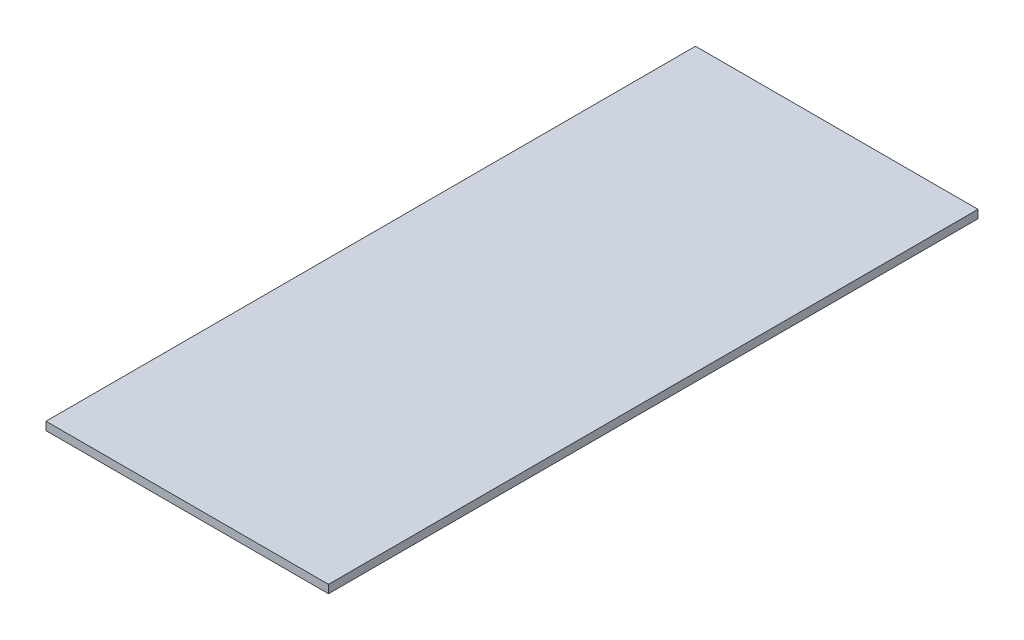
ISO-10303-21;
HEADER;
FILE_DESCRIPTION(('STEP AP214'),'2;1');
FILE_NAME('part.step','',(''),(''),'','','');
FILE_SCHEMA(('AUTOMOTIVE_DESIGN { 1 0 10303 214 1 1 1 1 }'));
ENDSEC;
DATA;
#1=APPLICATION_CONTEXT('core data for automotive mechanical design processes');
#2=APPLICATION_PROTOCOL_DEFINITION('international standard','automotive_design',2000,#1);
#3=PRODUCT_CONTEXT('',#1,'mechanical');
#4=PRODUCT('Part','Part','',(#3));
#5=PRODUCT_RELATED_PRODUCT_CATEGORY('part','',(#4));
#6=PRODUCT_DEFINITION_FORMATION('','',#4);
#7=PRODUCT_DEFINITION_CONTEXT('part definition',#1,'design');
#8=PRODUCT_DEFINITION('design','',#6,#7);
#9=PRODUCT_DEFINITION_SHAPE('','',#8);
#10=(LENGTH_UNIT() NAMED_UNIT(*) SI_UNIT(.MILLI.,.METRE.));
#11=(NAMED_UNIT(*) PLANE_ANGLE_UNIT() SI_UNIT($,.RADIAN.));
#12=(NAMED_UNIT(*) SI_UNIT($,.STERADIAN.) SOLID_ANGLE_UNIT());
#13=UNCERTAINTY_MEASURE_WITH_UNIT(LENGTH_MEASURE(1.E-05),#10,'distance_accuracy_value','');
#14=(GEOMETRIC_REPRESENTATION_CONTEXT(3) GLOBAL_UNCERTAINTY_ASSIGNED_CONTEXT((#13)) GLOBAL_UNIT_ASSIGNED_CONTEXT((#10,
#11,#12)) REPRESENTATION_CONTEXT('',''));
#15=CARTESIAN_POINT('',(0.,0.,0.));
#16=DIRECTION('',(0.,0.,1.));
#17=DIRECTION('',(1.,0.,0.));
#18=AXIS2_PLACEMENT_3D('',#15,#16,#17);
#19=CARTESIAN_POINT('',(-13.81,0.8,-31.75));
#20=DIRECTION('',(1.,0.,0.));
#21=DIRECTION('',(0.,0.,-1.));
#22=AXIS2_PLACEMENT_3D('',#19,#20,#21);
#23=PLANE('',#22);
#24=DIRECTION('',(0.,0.,1.));
#25=VECTOR('',#24,1.);
#26=CARTESIAN_POINT('',(-13.81,0.,-31.75));
#27=LINE('',#26,#25);
#28=CARTESIAN_POINT('',(-13.81,0.,-31.75));
#29=VERTEX_POINT('',#28);
#30=CARTESIAN_POINT('',(-13.81,0.,31.75));
#31=VERTEX_POINT('',#30);
#32=EDGE_CURVE('E107',#29,#31,#27,.T.);
#33=ORIENTED_EDGE('',*,*,#32,.T.);
#34=DIRECTION('',(0.,-1.,0.));
#35=VECTOR('',#34,1.);
#36=CARTESIAN_POINT('',(-13.81,0.8,31.75));
#37=LINE('',#36,#35);
#38=CARTESIAN_POINT('',(-13.81,0.8,31.75));
#39=VERTEX_POINT('',#38);
#40=EDGE_CURVE('E11',#39,#31,#37,.T.);
#41=ORIENTED_EDGE('',*,*,#40,.F.);
#42=DIRECTION('',(0.,0.,1.));
#43=VECTOR('',#42,1.);
#44=CARTESIAN_POINT('',(-13.81,0.8,-31.75));
#45=LINE('',#44,#43);
#46=CARTESIAN_POINT('',(-13.81,0.8,-31.75));
#47=VERTEX_POINT('',#46);
#48=EDGE_CURVE('E91',#47,#39,#45,.T.);
#49=ORIENTED_EDGE('',*,*,#48,.F.);
#50=DIRECTION('',(0.,-1.,0.));
#51=VECTOR('',#50,1.);
#52=CARTESIAN_POINT('',(-13.81,0.8,-31.75));
#53=LINE('',#52,#51);
#54=EDGE_CURVE('E103',#47,#29,#53,.T.);
#55=ORIENTED_EDGE('',*,*,#54,.T.);
#56=EDGE_LOOP('',(#33,#41,#49,#55));
#57=FACE_BOUND('',#56,.T.);
#58=ADVANCED_FACE('F39',(#57),#23,.F.);
#59=CARTESIAN_POINT('',(-13.81,0.8,31.75));
#60=DIRECTION('',(0.,0.,-1.));
#61=DIRECTION('',(-1.,0.,0.));
#62=AXIS2_PLACEMENT_3D('',#59,#60,#61);
#63=PLANE('',#62);
#64=DIRECTION('',(1.,0.,0.));
#65=VECTOR('',#64,1.);
#66=CARTESIAN_POINT('',(-13.81,0.,31.75));
#67=LINE('',#66,#65);
#68=CARTESIAN_POINT('',(13.81,0.,31.75));
#69=VERTEX_POINT('',#68);
#70=EDGE_CURVE('E96',#31,#69,#67,.T.);
#71=ORIENTED_EDGE('',*,*,#70,.T.);
#72=DIRECTION('',(0.,-1.,0.));
#73=VECTOR('',#72,1.);
#74=CARTESIAN_POINT('',(13.81,0.8,31.75));
#75=LINE('',#74,#73);
#76=CARTESIAN_POINT('',(13.81,0.8,31.75));
#77=VERTEX_POINT('',#76);
#78=EDGE_CURVE('E48',#77,#69,#75,.T.);
#79=ORIENTED_EDGE('',*,*,#78,.F.);
#80=DIRECTION('',(1.,0.,0.));
#81=VECTOR('',#80,1.);
#82=CARTESIAN_POINT('',(-13.81,0.8,31.75));
#83=LINE('',#82,#81);
#84=EDGE_CURVE('E86',#39,#77,#83,.T.);
#85=ORIENTED_EDGE('',*,*,#84,.F.);
#86=ORIENTED_EDGE('',*,*,#40,.T.);
#87=EDGE_LOOP('',(#71,#79,#85,#86));
#88=FACE_BOUND('',#87,.T.);
#89=ADVANCED_FACE('F95',(#88),#63,.F.);
#90=CARTESIAN_POINT('',(13.81,0.8,-31.75));
#91=DIRECTION('',(-1.,0.,0.));
#92=DIRECTION('',(0.,0.,1.));
#93=AXIS2_PLACEMENT_3D('',#90,#91,#92);
#94=PLANE('',#93);
#95=DIRECTION('',(0.,0.,-1.));
#96=VECTOR('',#95,1.);
#97=CARTESIAN_POINT('',(13.81,0.,-31.75));
#98=LINE('',#97,#96);
#99=CARTESIAN_POINT('',(13.81,0.,-31.75));
#100=VERTEX_POINT('',#99);
#101=EDGE_CURVE('E73',#69,#100,#98,.T.);
#102=ORIENTED_EDGE('',*,*,#101,.T.);
#103=DIRECTION('',(0.,-1.,0.));
#104=VECTOR('',#103,1.);
#105=CARTESIAN_POINT('',(13.81,0.8,-31.75));
#106=LINE('',#105,#104);
#107=CARTESIAN_POINT('',(13.81,0.8,-31.75));
#108=VERTEX_POINT('',#107);
#109=EDGE_CURVE('E98',#108,#100,#106,.T.);
#110=ORIENTED_EDGE('',*,*,#109,.F.);
#111=DIRECTION('',(0.,0.,-1.));
#112=VECTOR('',#111,1.);
#113=CARTESIAN_POINT('',(13.81,0.8,-31.75));
#114=LINE('',#113,#112);
#115=EDGE_CURVE('E89',#77,#108,#114,.T.);
#116=ORIENTED_EDGE('',*,*,#115,.F.);
#117=ORIENTED_EDGE('',*,*,#78,.T.);
#118=EDGE_LOOP('',(#102,#110,#116,#117));
#119=FACE_BOUND('',#118,.T.);
#120=ADVANCED_FACE('F99',(#119),#94,.F.);
#121=CARTESIAN_POINT('',(-13.81,0.8,-31.75));
#122=DIRECTION('',(0.,0.,1.));
#123=DIRECTION('',(1.,0.,0.));
#124=AXIS2_PLACEMENT_3D('',#121,#122,#123);
#125=PLANE('',#124);
#126=DIRECTION('',(-1.,0.,0.));
#127=VECTOR('',#126,1.);
#128=CARTESIAN_POINT('',(-13.81,0.,-31.75));
#129=LINE('',#128,#127);
#130=EDGE_CURVE('E79',#100,#29,#129,.T.);
#131=ORIENTED_EDGE('',*,*,#130,.T.);
#132=ORIENTED_EDGE('',*,*,#54,.F.);
#133=DIRECTION('',(-1.,0.,0.));
#134=VECTOR('',#133,1.);
#135=CARTESIAN_POINT('',(-13.81,0.8,-31.75));
#136=LINE('',#135,#134);
#137=EDGE_CURVE('E56',#108,#47,#136,.T.);
#138=ORIENTED_EDGE('',*,*,#137,.F.);
#139=ORIENTED_EDGE('',*,*,#109,.T.);
#140=EDGE_LOOP('',(#131,#132,#138,#139));
#141=FACE_BOUND('',#140,.T.);
#142=ADVANCED_FACE('F120',(#141),#125,.F.);
#143=CARTESIAN_POINT('',(0.,0.8,0.));
#144=DIRECTION('',(0.,1.,0.));
#145=DIRECTION('',(0.,0.,1.));
#146=AXIS2_PLACEMENT_3D('',#143,#144,#145);
#147=PLANE('',#146);
#148=ORIENTED_EDGE('',*,*,#48,.T.);
#149=ORIENTED_EDGE('',*,*,#84,.T.);
#150=ORIENTED_EDGE('',*,*,#115,.T.);
#151=ORIENTED_EDGE('',*,*,#137,.T.);
#152=EDGE_LOOP('',(#148,#149,#150,#151));
#153=FACE_BOUND('',#152,.T.);
#154=ADVANCED_FACE('F87',(#153),#147,.T.);
#155=CARTESIAN_POINT('',(0.,0.,0.));
#156=DIRECTION('',(0.,1.,0.));
#157=DIRECTION('',(0.,0.,1.));
#158=AXIS2_PLACEMENT_3D('',#155,#156,#157);
#159=PLANE('',#158);
#160=ORIENTED_EDGE('',*,*,#32,.F.);
#161=ORIENTED_EDGE('',*,*,#130,.F.);
#162=ORIENTED_EDGE('',*,*,#101,.F.);
#163=ORIENTED_EDGE('',*,*,#70,.F.);
#164=EDGE_LOOP('',(#160,#161,#162,#163));
#165=FACE_BOUND('',#164,.T.);
#166=ADVANCED_FACE('F123',(#165),#159,.F.);
#167=CLOSED_SHELL('',(#58,#89,#120,#142,#154,#166));
#168=MANIFOLD_SOLID_BREP('B2',#167);
#169=ADVANCED_BREP_SHAPE_REPRESENTATION('',(#18,#168),#14);
#170=SHAPE_DEFINITION_REPRESENTATION(#9,#169);
ENDSEC;
END-ISO-10303-21;
